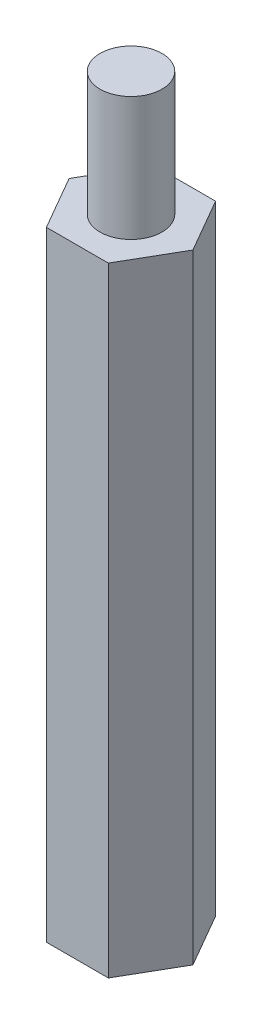
ISO-10303-21;
HEADER;
FILE_DESCRIPTION(('STEP AP214'),'2;1');
FILE_NAME('part.step','',(''),(''),'','','');
FILE_SCHEMA(('AUTOMOTIVE_DESIGN { 1 0 10303 214 1 1 1 1 }'));
ENDSEC;
DATA;
#1=APPLICATION_CONTEXT('core data for automotive mechanical design processes');
#2=APPLICATION_PROTOCOL_DEFINITION('international standard','automotive_design',2000,#1);
#3=PRODUCT_CONTEXT('',#1,'mechanical');
#4=PRODUCT('Part','Part','',(#3));
#5=PRODUCT_RELATED_PRODUCT_CATEGORY('part','',(#4));
#6=PRODUCT_DEFINITION_FORMATION('','',#4);
#7=PRODUCT_DEFINITION_CONTEXT('part definition',#1,'design');
#8=PRODUCT_DEFINITION('design','',#6,#7);
#9=PRODUCT_DEFINITION_SHAPE('','',#8);
#10=(LENGTH_UNIT() NAMED_UNIT(*) SI_UNIT(.MILLI.,.METRE.));
#11=(NAMED_UNIT(*) PLANE_ANGLE_UNIT() SI_UNIT($,.RADIAN.));
#12=(NAMED_UNIT(*) SI_UNIT($,.STERADIAN.) SOLID_ANGLE_UNIT());
#13=UNCERTAINTY_MEASURE_WITH_UNIT(LENGTH_MEASURE(1.E-05),#10,'distance_accuracy_value','');
#14=(GEOMETRIC_REPRESENTATION_CONTEXT(3) GLOBAL_UNCERTAINTY_ASSIGNED_CONTEXT((#13)) GLOBAL_UNIT_ASSIGNED_CONTEXT((#10,
#11,#12)) REPRESENTATION_CONTEXT('',''));
#15=CARTESIAN_POINT('',(0.,0.,0.));
#16=DIRECTION('',(0.,0.,1.));
#17=DIRECTION('',(1.,0.,0.));
#18=AXIS2_PLACEMENT_3D('',#15,#16,#17);
#19=CARTESIAN_POINT('',(0.,30.,0.));
#20=DIRECTION('',(0.,1.,0.));
#21=DIRECTION('',(0.,0.,1.));
#22=AXIS2_PLACEMENT_3D('',#19,#20,#21);
#23=CYLINDRICAL_SURFACE('',#22,1.24999999999999);
#24=CARTESIAN_POINT('',(0.,0.,0.));
#25=DIRECTION('',(0.,1.,0.));
#26=DIRECTION('',(0.,0.,1.));
#27=AXIS2_PLACEMENT_3D('',#24,#25,#26);
#28=CIRCLE('',#27,1.24999999999999);
#29=CARTESIAN_POINT('',(0.,0.,1.24999999999999));
#30=VERTEX_POINT('',#29);
#31=EDGE_CURVE('E127',#30,#30,#28,.T.);
#32=ORIENTED_EDGE('',*,*,#31,.F.);
#33=EDGE_LOOP('',(#32));
#34=FACE_BOUND('',#33,.T.);
#35=CARTESIAN_POINT('',(0.,25.,0.));
#36=DIRECTION('',(0.,1.,0.));
#37=DIRECTION('',(0.,0.,1.));
#38=AXIS2_PLACEMENT_3D('',#35,#36,#37);
#39=CIRCLE('',#38,1.24999999999999);
#40=CARTESIAN_POINT('',(0.,25.,1.24999999999999));
#41=VERTEX_POINT('',#40);
#42=EDGE_CURVE('E46',#41,#41,#39,.F.);
#43=ORIENTED_EDGE('',*,*,#42,.F.);
#44=EDGE_LOOP('',(#43));
#45=FACE_BOUND('',#44,.T.);
#46=ADVANCED_FACE('F37',(#34,#45),#23,.F.);
#47=CARTESIAN_POINT('',(3.,30.,0.));
#48=DIRECTION('',(-0.866025403784439,0.,0.5));
#49=DIRECTION('',(0.5,0.,0.866025403784439));
#50=AXIS2_PLACEMENT_3D('',#47,#48,#49);
#51=PLANE('',#50);
#52=DIRECTION('',(-0.5,0.,-0.866025403784439));
#53=VECTOR('',#52,1.);
#54=CARTESIAN_POINT('',(3.,0.,0.));
#55=LINE('',#54,#53);
#56=CARTESIAN_POINT('',(3.,0.,0.));
#57=VERTEX_POINT('',#56);
#58=CARTESIAN_POINT('',(1.5,0.,-2.59807621135332));
#59=VERTEX_POINT('',#58);
#60=EDGE_CURVE('E123',#57,#59,#55,.T.);
#61=ORIENTED_EDGE('',*,*,#60,.T.);
#62=DIRECTION('',(0.,-1.,0.));
#63=VECTOR('',#62,1.);
#64=CARTESIAN_POINT('',(1.5,30.,-2.59807621135332));
#65=LINE('',#64,#63);
#66=CARTESIAN_POINT('',(1.5,30.,-2.59807621135332));
#67=VERTEX_POINT('',#66);
#68=EDGE_CURVE('E141',#67,#59,#65,.T.);
#69=ORIENTED_EDGE('',*,*,#68,.F.);
#70=DIRECTION('',(-0.5,0.,-0.866025403784439));
#71=VECTOR('',#70,1.);
#72=CARTESIAN_POINT('',(3.,30.,0.));
#73=LINE('',#72,#71);
#74=CARTESIAN_POINT('',(3.,30.,0.));
#75=VERTEX_POINT('',#74);
#76=EDGE_CURVE('E134',#75,#67,#73,.T.);
#77=ORIENTED_EDGE('',*,*,#76,.F.);
#78=DIRECTION('',(0.,-1.,0.));
#79=VECTOR('',#78,1.);
#80=CARTESIAN_POINT('',(3.,30.,0.));
#81=LINE('',#80,#79);
#82=EDGE_CURVE('E119',#75,#57,#81,.T.);
#83=ORIENTED_EDGE('',*,*,#82,.T.);
#84=EDGE_LOOP('',(#61,#69,#77,#83));
#85=FACE_BOUND('',#84,.T.);
#86=ADVANCED_FACE('F39',(#85),#51,.F.);
#87=CARTESIAN_POINT('',(1.5,30.,-2.59807621135332));
#88=DIRECTION('',(0.,0.,1.));
#89=DIRECTION('',(1.,0.,0.));
#90=AXIS2_PLACEMENT_3D('',#87,#88,#89);
#91=PLANE('',#90);
#92=DIRECTION('',(-1.,0.,0.));
#93=VECTOR('',#92,1.);
#94=CARTESIAN_POINT('',(1.5,0.,-2.59807621135332));
#95=LINE('',#94,#93);
#96=CARTESIAN_POINT('',(-1.5,0.,-2.59807621135332));
#97=VERTEX_POINT('',#96);
#98=EDGE_CURVE('E126',#59,#97,#95,.T.);
#99=ORIENTED_EDGE('',*,*,#98,.T.);
#100=DIRECTION('',(0.,-1.,0.));
#101=VECTOR('',#100,1.);
#102=CARTESIAN_POINT('',(-1.5,30.,-2.59807621135332));
#103=LINE('',#102,#101);
#104=CARTESIAN_POINT('',(-1.5,30.,-2.59807621135332));
#105=VERTEX_POINT('',#104);
#106=EDGE_CURVE('E138',#105,#97,#103,.T.);
#107=ORIENTED_EDGE('',*,*,#106,.F.);
#108=DIRECTION('',(-1.,0.,0.));
#109=VECTOR('',#108,1.);
#110=CARTESIAN_POINT('',(1.5,30.,-2.59807621135332));
#111=LINE('',#110,#109);
#112=EDGE_CURVE('E92',#67,#105,#111,.T.);
#113=ORIENTED_EDGE('',*,*,#112,.F.);
#114=ORIENTED_EDGE('',*,*,#68,.T.);
#115=EDGE_LOOP('',(#99,#107,#113,#114));
#116=FACE_BOUND('',#115,.T.);
#117=ADVANCED_FACE('F153',(#116),#91,.F.);
#118=CARTESIAN_POINT('',(-1.5,30.,-2.59807621135332));
#119=DIRECTION('',(0.866025403784439,0.,0.5));
#120=DIRECTION('',(0.5,0.,-0.866025403784439));
#121=AXIS2_PLACEMENT_3D('',#118,#119,#120);
#122=PLANE('',#121);
#123=DIRECTION('',(-0.5,0.,0.866025403784439));
#124=VECTOR('',#123,1.);
#125=CARTESIAN_POINT('',(-1.5,0.,-2.59807621135332));
#126=LINE('',#125,#124);
#127=CARTESIAN_POINT('',(-3.,0.,0.));
#128=VERTEX_POINT('',#127);
#129=EDGE_CURVE('E129',#97,#128,#126,.T.);
#130=ORIENTED_EDGE('',*,*,#129,.T.);
#131=DIRECTION('',(0.,-1.,0.));
#132=VECTOR('',#131,1.);
#133=CARTESIAN_POINT('',(-3.,30.,0.));
#134=LINE('',#133,#132);
#135=CARTESIAN_POINT('',(-3.,30.,0.));
#136=VERTEX_POINT('',#135);
#137=EDGE_CURVE('E114',#136,#128,#134,.T.);
#138=ORIENTED_EDGE('',*,*,#137,.F.);
#139=DIRECTION('',(-0.5,0.,0.866025403784439));
#140=VECTOR('',#139,1.);
#141=CARTESIAN_POINT('',(-1.5,30.,-2.59807621135332));
#142=LINE('',#141,#140);
#143=EDGE_CURVE('E105',#105,#136,#142,.T.);
#144=ORIENTED_EDGE('',*,*,#143,.F.);
#145=ORIENTED_EDGE('',*,*,#106,.T.);
#146=EDGE_LOOP('',(#130,#138,#144,#145));
#147=FACE_BOUND('',#146,.T.);
#148=ADVANCED_FACE('F174',(#147),#122,.F.);
#149=CARTESIAN_POINT('',(-3.,30.,0.));
#150=DIRECTION('',(0.866025403784439,0.,-0.5));
#151=DIRECTION('',(-0.5,0.,-0.866025403784439));
#152=AXIS2_PLACEMENT_3D('',#149,#150,#151);
#153=PLANE('',#152);
#154=DIRECTION('',(0.5,0.,0.866025403784439));
#155=VECTOR('',#154,1.);
#156=CARTESIAN_POINT('',(-3.,0.,0.));
#157=LINE('',#156,#155);
#158=CARTESIAN_POINT('',(-1.5,0.,2.59807621135332));
#159=VERTEX_POINT('',#158);
#160=EDGE_CURVE('E113',#128,#159,#157,.T.);
#161=ORIENTED_EDGE('',*,*,#160,.T.);
#162=DIRECTION('',(0.,-1.,0.));
#163=VECTOR('',#162,1.);
#164=CARTESIAN_POINT('',(-1.5,30.,2.59807621135332));
#165=LINE('',#164,#163);
#166=CARTESIAN_POINT('',(-1.5,30.,2.59807621135332));
#167=VERTEX_POINT('',#166);
#168=EDGE_CURVE('E110',#167,#159,#165,.T.);
#169=ORIENTED_EDGE('',*,*,#168,.F.);
#170=DIRECTION('',(0.5,0.,0.866025403784439));
#171=VECTOR('',#170,1.);
#172=CARTESIAN_POINT('',(-3.,30.,0.));
#173=LINE('',#172,#171);
#174=EDGE_CURVE('E99',#136,#167,#173,.T.);
#175=ORIENTED_EDGE('',*,*,#174,.F.);
#176=ORIENTED_EDGE('',*,*,#137,.T.);
#177=EDGE_LOOP('',(#161,#169,#175,#176));
#178=FACE_BOUND('',#177,.T.);
#179=ADVANCED_FACE('F111',(#178),#153,.F.);
#180=CARTESIAN_POINT('',(-1.5,30.,2.59807621135332));
#181=DIRECTION('',(0.,0.,-1.));
#182=DIRECTION('',(-1.,0.,0.));
#183=AXIS2_PLACEMENT_3D('',#180,#181,#182);
#184=PLANE('',#183);
#185=DIRECTION('',(1.,0.,0.));
#186=VECTOR('',#185,1.);
#187=CARTESIAN_POINT('',(-1.5,0.,2.59807621135332));
#188=LINE('',#187,#186);
#189=CARTESIAN_POINT('',(1.5,0.,2.59807621135332));
#190=VERTEX_POINT('',#189);
#191=EDGE_CURVE('E77',#159,#190,#188,.T.);
#192=ORIENTED_EDGE('',*,*,#191,.T.);
#193=DIRECTION('',(0.,-1.,0.));
#194=VECTOR('',#193,1.);
#195=CARTESIAN_POINT('',(1.5,30.,2.59807621135332));
#196=LINE('',#195,#194);
#197=CARTESIAN_POINT('',(1.5,30.,2.59807621135332));
#198=VERTEX_POINT('',#197);
#199=EDGE_CURVE('E115',#198,#190,#196,.T.);
#200=ORIENTED_EDGE('',*,*,#199,.F.);
#201=DIRECTION('',(1.,0.,0.));
#202=VECTOR('',#201,1.);
#203=CARTESIAN_POINT('',(-1.5,30.,2.59807621135332));
#204=LINE('',#203,#202);
#205=EDGE_CURVE('E103',#167,#198,#204,.T.);
#206=ORIENTED_EDGE('',*,*,#205,.F.);
#207=ORIENTED_EDGE('',*,*,#168,.T.);
#208=EDGE_LOOP('',(#192,#200,#206,#207));
#209=FACE_BOUND('',#208,.T.);
#210=ADVANCED_FACE('F117',(#209),#184,.F.);
#211=CARTESIAN_POINT('',(1.5,30.,2.59807621135332));
#212=DIRECTION('',(-0.866025403784439,0.,-0.5));
#213=DIRECTION('',(-0.5,0.,0.866025403784439));
#214=AXIS2_PLACEMENT_3D('',#211,#212,#213);
#215=PLANE('',#214);
#216=DIRECTION('',(0.5,0.,-0.866025403784439));
#217=VECTOR('',#216,1.);
#218=CARTESIAN_POINT('',(1.5,0.,2.59807621135332));
#219=LINE('',#218,#217);
#220=EDGE_CURVE('E83',#190,#57,#219,.T.);
#221=ORIENTED_EDGE('',*,*,#220,.T.);
#222=ORIENTED_EDGE('',*,*,#82,.F.);
#223=DIRECTION('',(0.5,0.,-0.866025403784439));
#224=VECTOR('',#223,1.);
#225=CARTESIAN_POINT('',(1.5,30.,2.59807621135332));
#226=LINE('',#225,#224);
#227=EDGE_CURVE('E54',#198,#75,#226,.T.);
#228=ORIENTED_EDGE('',*,*,#227,.F.);
#229=ORIENTED_EDGE('',*,*,#199,.T.);
#230=EDGE_LOOP('',(#221,#222,#228,#229));
#231=FACE_BOUND('',#230,.T.);
#232=ADVANCED_FACE('F163',(#231),#215,.F.);
#233=CARTESIAN_POINT('',(0.,30.,0.));
#234=DIRECTION('',(0.,1.,0.));
#235=DIRECTION('',(0.,0.,1.));
#236=AXIS2_PLACEMENT_3D('',#233,#234,#235);
#237=PLANE('',#236);
#238=CARTESIAN_POINT('',(0.,30.,0.));
#239=DIRECTION('',(0.,1.,0.));
#240=DIRECTION('',(0.,0.,1.));
#241=AXIS2_PLACEMENT_3D('',#238,#239,#240);
#242=CIRCLE('',#241,1.5);
#243=CARTESIAN_POINT('',(0.,30.,1.5));
#244=VERTEX_POINT('',#243);
#245=EDGE_CURVE('E11',#244,#244,#242,.T.);
#246=ORIENTED_EDGE('',*,*,#245,.F.);
#247=EDGE_LOOP('',(#246));
#248=FACE_BOUND('',#247,.T.);
#249=ORIENTED_EDGE('',*,*,#76,.T.);
#250=ORIENTED_EDGE('',*,*,#112,.T.);
#251=ORIENTED_EDGE('',*,*,#143,.T.);
#252=ORIENTED_EDGE('',*,*,#174,.T.);
#253=ORIENTED_EDGE('',*,*,#205,.T.);
#254=ORIENTED_EDGE('',*,*,#227,.T.);
#255=EDGE_LOOP('',(#249,#250,#251,#252,#253,#254));
#256=FACE_BOUND('',#255,.T.);
#257=ADVANCED_FACE('F101',(#248,#256),#237,.T.);
#258=CARTESIAN_POINT('',(0.,0.,0.));
#259=DIRECTION('',(0.,1.,0.));
#260=DIRECTION('',(0.,0.,1.));
#261=AXIS2_PLACEMENT_3D('',#258,#259,#260);
#262=PLANE('',#261);
#263=ORIENTED_EDGE('',*,*,#31,.T.);
#264=EDGE_LOOP('',(#263));
#265=FACE_BOUND('',#264,.T.);
#266=ORIENTED_EDGE('',*,*,#60,.F.);
#267=ORIENTED_EDGE('',*,*,#220,.F.);
#268=ORIENTED_EDGE('',*,*,#191,.F.);
#269=ORIENTED_EDGE('',*,*,#160,.F.);
#270=ORIENTED_EDGE('',*,*,#129,.F.);
#271=ORIENTED_EDGE('',*,*,#98,.F.);
#272=EDGE_LOOP('',(#266,#267,#268,#269,#270,#271));
#273=FACE_BOUND('',#272,.T.);
#274=ADVANCED_FACE('F162',(#265,#273),#262,.F.);
#275=CARTESIAN_POINT('',(0.,25.,0.));
#276=DIRECTION('',(0.,1.,0.));
#277=DIRECTION('',(0.,0.,1.));
#278=AXIS2_PLACEMENT_3D('',#275,#276,#277);
#279=PLANE('',#278);
#280=ORIENTED_EDGE('',*,*,#42,.T.);
#281=EDGE_LOOP('',(#280));
#282=FACE_BOUND('',#281,.T.);
#283=ADVANCED_FACE('F145',(#282),#279,.F.);
#284=CARTESIAN_POINT('',(0.,25.,0.));
#285=DIRECTION('',(0.,1.,0.));
#286=DIRECTION('',(0.,0.,1.));
#287=AXIS2_PLACEMENT_3D('',#284,#285,#286);
#288=CYLINDRICAL_SURFACE('',#287,1.5);
#289=ORIENTED_EDGE('',*,*,#245,.T.);
#290=EDGE_LOOP('',(#289));
#291=FACE_BOUND('',#290,.T.);
#292=CARTESIAN_POINT('',(0.,36.,0.));
#293=DIRECTION('',(0.,1.,0.));
#294=DIRECTION('',(0.,0.,1.));
#295=AXIS2_PLACEMENT_3D('',#292,#293,#294);
#296=CIRCLE('',#295,1.5);
#297=CARTESIAN_POINT('',(0.,36.,1.5));
#298=VERTEX_POINT('',#297);
#299=EDGE_CURVE('E190',#298,#298,#296,.T.);
#300=ORIENTED_EDGE('',*,*,#299,.F.);
#301=EDGE_LOOP('',(#300));
#302=FACE_BOUND('',#301,.T.);
#303=ADVANCED_FACE('F158',(#291,#302),#288,.T.);
#304=CARTESIAN_POINT('',(0.,36.,0.));
#305=DIRECTION('',(0.,1.,0.));
#306=DIRECTION('',(0.,0.,1.));
#307=AXIS2_PLACEMENT_3D('',#304,#305,#306);
#308=PLANE('',#307);
#309=ORIENTED_EDGE('',*,*,#299,.T.);
#310=EDGE_LOOP('',(#309));
#311=FACE_BOUND('',#310,.T.);
#312=ADVANCED_FACE('F194',(#311),#308,.T.);
#313=CLOSED_SHELL('',(#46,#86,#117,#148,#179,#210,#232,#257,#274,#283,#303,#312));
#314=MANIFOLD_SOLID_BREP('B2',#313);
#315=ADVANCED_BREP_SHAPE_REPRESENTATION('',(#18,#314),#14);
#316=SHAPE_DEFINITION_REPRESENTATION(#9,#315);
ENDSEC;
END-ISO-10303-21;
